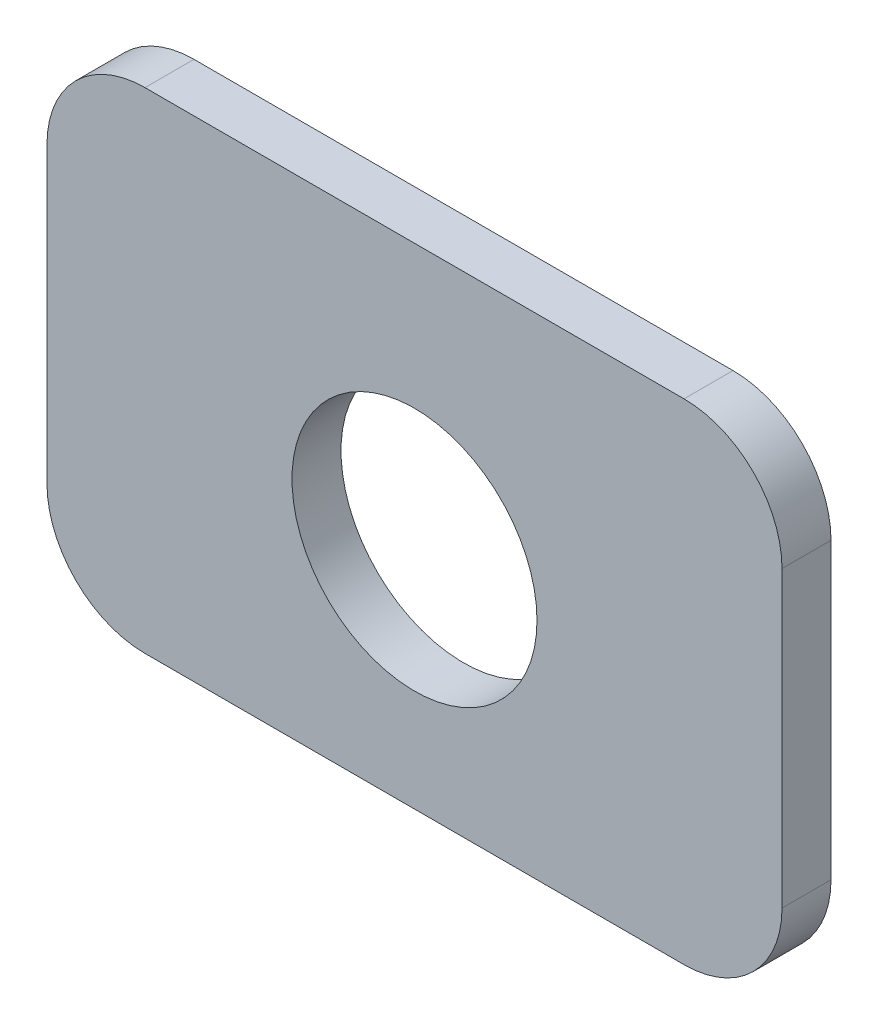
ISO-10303-21;
HEADER;
FILE_DESCRIPTION(('STEP AP214'),'2;1');
FILE_NAME('part.step','',(''),(''),'','','');
FILE_SCHEMA(('AUTOMOTIVE_DESIGN { 1 0 10303 214 1 1 1 1 }'));
ENDSEC;
DATA;
#1=APPLICATION_CONTEXT('core data for automotive mechanical design processes');
#2=APPLICATION_PROTOCOL_DEFINITION('international standard','automotive_design',2000,#1);
#3=PRODUCT_CONTEXT('',#1,'mechanical');
#4=PRODUCT('Part','Part','',(#3));
#5=PRODUCT_RELATED_PRODUCT_CATEGORY('part','',(#4));
#6=PRODUCT_DEFINITION_FORMATION('','',#4);
#7=PRODUCT_DEFINITION_CONTEXT('part definition',#1,'design');
#8=PRODUCT_DEFINITION('design','',#6,#7);
#9=PRODUCT_DEFINITION_SHAPE('','',#8);
#10=(LENGTH_UNIT() NAMED_UNIT(*) SI_UNIT(.MILLI.,.METRE.));
#11=(NAMED_UNIT(*) PLANE_ANGLE_UNIT() SI_UNIT($,.RADIAN.));
#12=(NAMED_UNIT(*) SI_UNIT($,.STERADIAN.) SOLID_ANGLE_UNIT());
#13=UNCERTAINTY_MEASURE_WITH_UNIT(LENGTH_MEASURE(1.E-05),#10,'distance_accuracy_value','');
#14=(GEOMETRIC_REPRESENTATION_CONTEXT(3) GLOBAL_UNCERTAINTY_ASSIGNED_CONTEXT((#13)) GLOBAL_UNIT_ASSIGNED_CONTEXT((#10,
#11,#12)) REPRESENTATION_CONTEXT('',''));
#15=CARTESIAN_POINT('',(0.,0.,0.));
#16=DIRECTION('',(0.,0.,1.));
#17=DIRECTION('',(1.,0.,0.));
#18=AXIS2_PLACEMENT_3D('',#15,#16,#17);
#19=CARTESIAN_POINT('',(5.5,3.,1.));
#20=DIRECTION('',(0.,0.,-1.));
#21=DIRECTION('',(-1.,0.,0.));
#22=AXIS2_PLACEMENT_3D('',#19,#20,#21);
#23=PLANE('',#22);
#24=CARTESIAN_POINT('',(5.5,3.,1.));
#25=DIRECTION('',(0.,0.,1.));
#26=DIRECTION('',(-1.,0.,0.));
#27=AXIS2_PLACEMENT_3D('',#24,#25,#26);
#28=CIRCLE('',#27,2.);
#29=CARTESIAN_POINT('',(7.5,3.,1.));
#30=VERTEX_POINT('',#29);
#31=CARTESIAN_POINT('',(5.5,5.,1.));
#32=VERTEX_POINT('',#31);
#33=EDGE_CURVE('E144',#30,#32,#28,.T.);
#34=ORIENTED_EDGE('',*,*,#33,.T.);
#35=DIRECTION('',(-1.,0.,0.));
#36=VECTOR('',#35,1.);
#37=CARTESIAN_POINT('',(-5.5,5.,1.));
#38=LINE('',#37,#36);
#39=CARTESIAN_POINT('',(-5.5,5.,1.));
#40=VERTEX_POINT('',#39);
#41=EDGE_CURVE('E92',#32,#40,#38,.T.);
#42=ORIENTED_EDGE('',*,*,#41,.T.);
#43=CARTESIAN_POINT('',(-5.5,3.,1.));
#44=DIRECTION('',(0.,0.,1.));
#45=DIRECTION('',(1.,0.,0.));
#46=AXIS2_PLACEMENT_3D('',#43,#44,#45);
#47=CIRCLE('',#46,2.);
#48=CARTESIAN_POINT('',(-7.5,3.,1.));
#49=VERTEX_POINT('',#48);
#50=EDGE_CURVE('E159',#40,#49,#47,.T.);
#51=ORIENTED_EDGE('',*,*,#50,.T.);
#52=DIRECTION('',(0.,-1.,0.));
#53=VECTOR('',#52,1.);
#54=CARTESIAN_POINT('',(-7.5,3.,1.));
#55=LINE('',#54,#53);
#56=CARTESIAN_POINT('',(-7.5,-3.,1.));
#57=VERTEX_POINT('',#56);
#58=EDGE_CURVE('E172',#49,#57,#55,.T.);
#59=ORIENTED_EDGE('',*,*,#58,.T.);
#60=CARTESIAN_POINT('',(-5.5,-3.,1.));
#61=DIRECTION('',(0.,0.,1.));
#62=DIRECTION('',(1.,0.,0.));
#63=AXIS2_PLACEMENT_3D('',#60,#61,#62);
#64=CIRCLE('',#63,2.);
#65=CARTESIAN_POINT('',(-5.5,-5.,1.));
#66=VERTEX_POINT('',#65);
#67=EDGE_CURVE('E111',#57,#66,#64,.T.);
#68=ORIENTED_EDGE('',*,*,#67,.T.);
#69=DIRECTION('',(1.,0.,0.));
#70=VECTOR('',#69,1.);
#71=CARTESIAN_POINT('',(-5.5,-5.,1.));
#72=LINE('',#71,#70);
#73=CARTESIAN_POINT('',(5.5,-5.,1.));
#74=VERTEX_POINT('',#73);
#75=EDGE_CURVE('E105',#66,#74,#72,.T.);
#76=ORIENTED_EDGE('',*,*,#75,.T.);
#77=CARTESIAN_POINT('',(5.5,-3.,1.));
#78=DIRECTION('',(0.,0.,1.));
#79=DIRECTION('',(1.,0.,0.));
#80=AXIS2_PLACEMENT_3D('',#77,#78,#79);
#81=CIRCLE('',#80,2.);
#82=CARTESIAN_POINT('',(7.5,-3.,1.));
#83=VERTEX_POINT('',#82);
#84=EDGE_CURVE('E109',#74,#83,#81,.T.);
#85=ORIENTED_EDGE('',*,*,#84,.T.);
#86=DIRECTION('',(0.,1.,0.));
#87=VECTOR('',#86,1.);
#88=CARTESIAN_POINT('',(7.5,3.,1.));
#89=LINE('',#88,#87);
#90=EDGE_CURVE('E49',#83,#30,#89,.T.);
#91=ORIENTED_EDGE('',*,*,#90,.T.);
#92=EDGE_LOOP('',(#34,#42,#51,#59,#68,#76,#85,#91));
#93=FACE_BOUND('',#92,.T.);
#94=CARTESIAN_POINT('',(0.,-0.415981233576255,1.));
#95=DIRECTION('',(0.,0.,1.));
#96=DIRECTION('',(1.,0.,0.));
#97=AXIS2_PLACEMENT_3D('',#94,#95,#96);
#98=CIRCLE('',#97,2.5);
#99=CARTESIAN_POINT('',(2.5,-0.415981233576255,1.));
#100=VERTEX_POINT('',#99);
#101=EDGE_CURVE('E133',#100,#100,#98,.T.);
#102=ORIENTED_EDGE('',*,*,#101,.F.);
#103=EDGE_LOOP('',(#102));
#104=FACE_BOUND('',#103,.T.);
#105=ADVANCED_FACE('F32',(#93,#104),#23,.F.);
#106=CARTESIAN_POINT('',(5.5,3.,0.));
#107=DIRECTION('',(0.,0.,-1.));
#108=DIRECTION('',(-1.,0.,0.));
#109=AXIS2_PLACEMENT_3D('',#106,#107,#108);
#110=PLANE('',#109);
#111=CARTESIAN_POINT('',(5.5,3.,0.));
#112=DIRECTION('',(0.,0.,1.));
#113=DIRECTION('',(-1.,0.,0.));
#114=AXIS2_PLACEMENT_3D('',#111,#112,#113);
#115=CIRCLE('',#114,2.);
#116=CARTESIAN_POINT('',(7.5,3.,0.));
#117=VERTEX_POINT('',#116);
#118=CARTESIAN_POINT('',(5.5,5.,0.));
#119=VERTEX_POINT('',#118);
#120=EDGE_CURVE('E129',#117,#119,#115,.T.);
#121=ORIENTED_EDGE('',*,*,#120,.F.);
#122=DIRECTION('',(0.,1.,0.));
#123=VECTOR('',#122,1.);
#124=CARTESIAN_POINT('',(7.5,3.,0.));
#125=LINE('',#124,#123);
#126=CARTESIAN_POINT('',(7.5,-3.,0.));
#127=VERTEX_POINT('',#126);
#128=EDGE_CURVE('E84',#127,#117,#125,.T.);
#129=ORIENTED_EDGE('',*,*,#128,.F.);
#130=CARTESIAN_POINT('',(5.5,-3.,0.));
#131=DIRECTION('',(0.,0.,1.));
#132=DIRECTION('',(1.,0.,0.));
#133=AXIS2_PLACEMENT_3D('',#130,#131,#132);
#134=CIRCLE('',#133,2.);
#135=CARTESIAN_POINT('',(5.5,-5.,0.));
#136=VERTEX_POINT('',#135);
#137=EDGE_CURVE('E78',#136,#127,#134,.T.);
#138=ORIENTED_EDGE('',*,*,#137,.F.);
#139=DIRECTION('',(1.,0.,0.));
#140=VECTOR('',#139,1.);
#141=CARTESIAN_POINT('',(-5.5,-5.,0.));
#142=LINE('',#141,#140);
#143=CARTESIAN_POINT('',(-5.5,-5.,0.));
#144=VERTEX_POINT('',#143);
#145=EDGE_CURVE('E119',#144,#136,#142,.T.);
#146=ORIENTED_EDGE('',*,*,#145,.F.);
#147=CARTESIAN_POINT('',(-5.5,-3.,0.));
#148=DIRECTION('',(0.,0.,1.));
#149=DIRECTION('',(1.,0.,0.));
#150=AXIS2_PLACEMENT_3D('',#147,#148,#149);
#151=CIRCLE('',#150,2.);
#152=CARTESIAN_POINT('',(-7.5,-3.,0.));
#153=VERTEX_POINT('',#152);
#154=EDGE_CURVE('E139',#153,#144,#151,.T.);
#155=ORIENTED_EDGE('',*,*,#154,.F.);
#156=DIRECTION('',(0.,-1.,0.));
#157=VECTOR('',#156,1.);
#158=CARTESIAN_POINT('',(-7.5,3.,0.));
#159=LINE('',#158,#157);
#160=CARTESIAN_POINT('',(-7.5,3.,0.));
#161=VERTEX_POINT('',#160);
#162=EDGE_CURVE('E137',#161,#153,#159,.T.);
#163=ORIENTED_EDGE('',*,*,#162,.F.);
#164=CARTESIAN_POINT('',(-5.5,3.,0.));
#165=DIRECTION('',(0.,0.,1.));
#166=DIRECTION('',(1.,0.,0.));
#167=AXIS2_PLACEMENT_3D('',#164,#165,#166);
#168=CIRCLE('',#167,2.);
#169=CARTESIAN_POINT('',(-5.5,5.,0.));
#170=VERTEX_POINT('',#169);
#171=EDGE_CURVE('E135',#170,#161,#168,.T.);
#172=ORIENTED_EDGE('',*,*,#171,.F.);
#173=DIRECTION('',(-1.,0.,0.));
#174=VECTOR('',#173,1.);
#175=CARTESIAN_POINT('',(-5.5,5.,0.));
#176=LINE('',#175,#174);
#177=EDGE_CURVE('E132',#119,#170,#176,.T.);
#178=ORIENTED_EDGE('',*,*,#177,.F.);
#179=EDGE_LOOP('',(#121,#129,#138,#146,#155,#163,#172,#178));
#180=FACE_BOUND('',#179,.T.);
#181=CARTESIAN_POINT('',(0.,-0.415981233576255,0.));
#182=DIRECTION('',(0.,0.,1.));
#183=DIRECTION('',(1.,0.,0.));
#184=AXIS2_PLACEMENT_3D('',#181,#182,#183);
#185=CIRCLE('',#184,2.5);
#186=CARTESIAN_POINT('',(2.5,-0.415981233576255,0.));
#187=VERTEX_POINT('',#186);
#188=EDGE_CURVE('E178',#187,#187,#185,.T.);
#189=ORIENTED_EDGE('',*,*,#188,.T.);
#190=EDGE_LOOP('',(#189));
#191=FACE_BOUND('',#190,.T.);
#192=ADVANCED_FACE('F163',(#180,#191),#110,.T.);
#193=CARTESIAN_POINT('',(5.5,3.,1.));
#194=DIRECTION('',(0.,0.,-1.));
#195=DIRECTION('',(-1.,0.,0.));
#196=AXIS2_PLACEMENT_3D('',#193,#194,#195);
#197=CYLINDRICAL_SURFACE('',#196,2.);
#198=ORIENTED_EDGE('',*,*,#120,.T.);
#199=DIRECTION('',(0.,0.,-1.));
#200=VECTOR('',#199,1.);
#201=CARTESIAN_POINT('',(5.5,5.,1.));
#202=LINE('',#201,#200);
#203=EDGE_CURVE('E11',#32,#119,#202,.T.);
#204=ORIENTED_EDGE('',*,*,#203,.F.);
#205=ORIENTED_EDGE('',*,*,#33,.F.);
#206=DIRECTION('',(0.,0.,-1.));
#207=VECTOR('',#206,1.);
#208=CARTESIAN_POINT('',(7.5,3.,1.));
#209=LINE('',#208,#207);
#210=EDGE_CURVE('E125',#30,#117,#209,.T.);
#211=ORIENTED_EDGE('',*,*,#210,.T.);
#212=EDGE_LOOP('',(#198,#204,#205,#211));
#213=FACE_BOUND('',#212,.T.);
#214=ADVANCED_FACE('F34',(#213),#197,.T.);
#215=CARTESIAN_POINT('',(-5.5,5.,1.));
#216=DIRECTION('',(0.,-1.,0.));
#217=DIRECTION('',(0.,0.,-1.));
#218=AXIS2_PLACEMENT_3D('',#215,#216,#217);
#219=PLANE('',#218);
#220=ORIENTED_EDGE('',*,*,#177,.T.);
#221=DIRECTION('',(0.,0.,-1.));
#222=VECTOR('',#221,1.);
#223=CARTESIAN_POINT('',(-5.5,5.,1.));
#224=LINE('',#223,#222);
#225=EDGE_CURVE('E41',#40,#170,#224,.T.);
#226=ORIENTED_EDGE('',*,*,#225,.F.);
#227=ORIENTED_EDGE('',*,*,#41,.F.);
#228=ORIENTED_EDGE('',*,*,#203,.T.);
#229=EDGE_LOOP('',(#220,#226,#227,#228));
#230=FACE_BOUND('',#229,.T.);
#231=ADVANCED_FACE('F206',(#230),#219,.F.);
#232=CARTESIAN_POINT('',(-5.5,3.,1.));
#233=DIRECTION('',(0.,0.,-1.));
#234=DIRECTION('',(-1.,0.,0.));
#235=AXIS2_PLACEMENT_3D('',#232,#233,#234);
#236=CYLINDRICAL_SURFACE('',#235,2.);
#237=ORIENTED_EDGE('',*,*,#171,.T.);
#238=DIRECTION('',(0.,0.,-1.));
#239=VECTOR('',#238,1.);
#240=CARTESIAN_POINT('',(-7.5,3.,1.));
#241=LINE('',#240,#239);
#242=EDGE_CURVE('E151',#49,#161,#241,.T.);
#243=ORIENTED_EDGE('',*,*,#242,.F.);
#244=ORIENTED_EDGE('',*,*,#50,.F.);
#245=ORIENTED_EDGE('',*,*,#225,.T.);
#246=EDGE_LOOP('',(#237,#243,#244,#245));
#247=FACE_BOUND('',#246,.T.);
#248=ADVANCED_FACE('F157',(#247),#236,.T.);
#249=CARTESIAN_POINT('',(-7.5,3.,1.));
#250=DIRECTION('',(1.,0.,0.));
#251=DIRECTION('',(0.,1.,0.));
#252=AXIS2_PLACEMENT_3D('',#249,#250,#251);
#253=PLANE('',#252);
#254=ORIENTED_EDGE('',*,*,#162,.T.);
#255=DIRECTION('',(0.,0.,-1.));
#256=VECTOR('',#255,1.);
#257=CARTESIAN_POINT('',(-7.5,-3.,1.));
#258=LINE('',#257,#256);
#259=EDGE_CURVE('E148',#57,#153,#258,.T.);
#260=ORIENTED_EDGE('',*,*,#259,.F.);
#261=ORIENTED_EDGE('',*,*,#58,.F.);
#262=ORIENTED_EDGE('',*,*,#242,.T.);
#263=EDGE_LOOP('',(#254,#260,#261,#262));
#264=FACE_BOUND('',#263,.T.);
#265=ADVANCED_FACE('F168',(#264),#253,.F.);
#266=CARTESIAN_POINT('',(-5.5,-3.,1.));
#267=DIRECTION('',(0.,0.,-1.));
#268=DIRECTION('',(-1.,0.,0.));
#269=AXIS2_PLACEMENT_3D('',#266,#267,#268);
#270=CYLINDRICAL_SURFACE('',#269,2.);
#271=ORIENTED_EDGE('',*,*,#154,.T.);
#272=DIRECTION('',(0.,0.,-1.));
#273=VECTOR('',#272,1.);
#274=CARTESIAN_POINT('',(-5.5,-5.,1.));
#275=LINE('',#274,#273);
#276=EDGE_CURVE('E120',#66,#144,#275,.T.);
#277=ORIENTED_EDGE('',*,*,#276,.F.);
#278=ORIENTED_EDGE('',*,*,#67,.F.);
#279=ORIENTED_EDGE('',*,*,#259,.T.);
#280=EDGE_LOOP('',(#271,#277,#278,#279));
#281=FACE_BOUND('',#280,.T.);
#282=ADVANCED_FACE('F171',(#281),#270,.T.);
#283=CARTESIAN_POINT('',(-5.5,-5.,1.));
#284=DIRECTION('',(0.,1.,0.));
#285=DIRECTION('',(0.,0.,1.));
#286=AXIS2_PLACEMENT_3D('',#283,#284,#285);
#287=PLANE('',#286);
#288=ORIENTED_EDGE('',*,*,#145,.T.);
#289=DIRECTION('',(0.,0.,-1.));
#290=VECTOR('',#289,1.);
#291=CARTESIAN_POINT('',(5.5,-5.,1.));
#292=LINE('',#291,#290);
#293=EDGE_CURVE('E116',#74,#136,#292,.T.);
#294=ORIENTED_EDGE('',*,*,#293,.F.);
#295=ORIENTED_EDGE('',*,*,#75,.F.);
#296=ORIENTED_EDGE('',*,*,#276,.T.);
#297=EDGE_LOOP('',(#288,#294,#295,#296));
#298=FACE_BOUND('',#297,.T.);
#299=ADVANCED_FACE('F117',(#298),#287,.F.);
#300=CARTESIAN_POINT('',(5.5,-3.,1.));
#301=DIRECTION('',(0.,0.,-1.));
#302=DIRECTION('',(-1.,0.,0.));
#303=AXIS2_PLACEMENT_3D('',#300,#301,#302);
#304=CYLINDRICAL_SURFACE('',#303,2.);
#305=ORIENTED_EDGE('',*,*,#137,.T.);
#306=DIRECTION('',(0.,0.,-1.));
#307=VECTOR('',#306,1.);
#308=CARTESIAN_POINT('',(7.5,-3.,1.));
#309=LINE('',#308,#307);
#310=EDGE_CURVE('E121',#83,#127,#309,.T.);
#311=ORIENTED_EDGE('',*,*,#310,.F.);
#312=ORIENTED_EDGE('',*,*,#84,.F.);
#313=ORIENTED_EDGE('',*,*,#293,.T.);
#314=EDGE_LOOP('',(#305,#311,#312,#313));
#315=FACE_BOUND('',#314,.T.);
#316=ADVANCED_FACE('F123',(#315),#304,.T.);
#317=CARTESIAN_POINT('',(7.5,3.,1.));
#318=DIRECTION('',(-1.,0.,0.));
#319=DIRECTION('',(0.,0.,1.));
#320=AXIS2_PLACEMENT_3D('',#317,#318,#319);
#321=PLANE('',#320);
#322=ORIENTED_EDGE('',*,*,#128,.T.);
#323=ORIENTED_EDGE('',*,*,#210,.F.);
#324=ORIENTED_EDGE('',*,*,#90,.F.);
#325=ORIENTED_EDGE('',*,*,#310,.T.);
#326=EDGE_LOOP('',(#322,#323,#324,#325));
#327=FACE_BOUND('',#326,.T.);
#328=ADVANCED_FACE('F194',(#327),#321,.F.);
#329=CARTESIAN_POINT('',(0.,-0.415981233576255,1.));
#330=DIRECTION('',(0.,0.,-1.));
#331=DIRECTION('',(-1.,0.,0.));
#332=AXIS2_PLACEMENT_3D('',#329,#330,#331);
#333=CYLINDRICAL_SURFACE('',#332,2.5);
#334=ORIENTED_EDGE('',*,*,#101,.T.);
#335=EDGE_LOOP('',(#334));
#336=FACE_BOUND('',#335,.T.);
#337=ORIENTED_EDGE('',*,*,#188,.F.);
#338=EDGE_LOOP('',(#337));
#339=FACE_BOUND('',#338,.T.);
#340=ADVANCED_FACE('F184',(#336,#339),#333,.F.);
#341=CLOSED_SHELL('',(#105,#192,#214,#231,#248,#265,#282,#299,#316,#328,#340));
#342=MANIFOLD_SOLID_BREP('B2',#341);
#343=ADVANCED_BREP_SHAPE_REPRESENTATION('',(#18,#342),#14);
#344=SHAPE_DEFINITION_REPRESENTATION(#9,#343);
ENDSEC;
END-ISO-10303-21;
